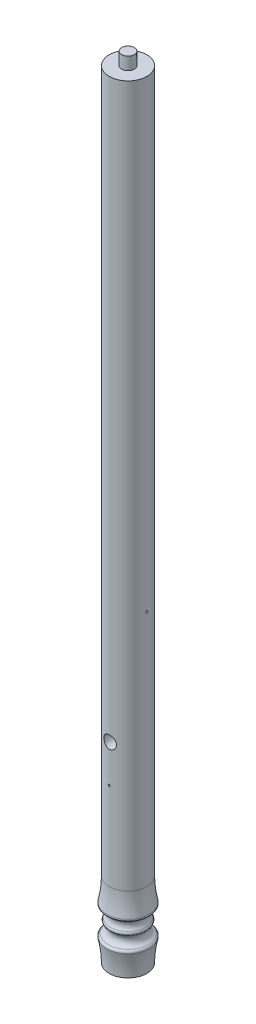
ISO-10303-21;
HEADER;
FILE_DESCRIPTION(('STEP AP214'),'2;1');
FILE_NAME('part.step','',(''),(''),'','','');
FILE_SCHEMA(('AUTOMOTIVE_DESIGN { 1 0 10303 214 1 1 1 1 }'));
ENDSEC;
DATA;
#1=APPLICATION_CONTEXT('core data for automotive mechanical design processes');
#2=APPLICATION_PROTOCOL_DEFINITION('international standard','automotive_design',2000,#1);
#3=PRODUCT_CONTEXT('',#1,'mechanical');
#4=PRODUCT('Part','Part','',(#3));
#5=PRODUCT_RELATED_PRODUCT_CATEGORY('part','',(#4));
#6=PRODUCT_DEFINITION_FORMATION('','',#4);
#7=PRODUCT_DEFINITION_CONTEXT('part definition',#1,'design');
#8=PRODUCT_DEFINITION('design','',#6,#7);
#9=PRODUCT_DEFINITION_SHAPE('','',#8);
#10=(LENGTH_UNIT() NAMED_UNIT(*) SI_UNIT(.MILLI.,.METRE.));
#11=(NAMED_UNIT(*) PLANE_ANGLE_UNIT() SI_UNIT($,.RADIAN.));
#12=(NAMED_UNIT(*) SI_UNIT($,.STERADIAN.) SOLID_ANGLE_UNIT());
#13=UNCERTAINTY_MEASURE_WITH_UNIT(LENGTH_MEASURE(1.E-05),#10,'distance_accuracy_value','');
#14=(GEOMETRIC_REPRESENTATION_CONTEXT(3) GLOBAL_UNCERTAINTY_ASSIGNED_CONTEXT((#13)) GLOBAL_UNIT_ASSIGNED_CONTEXT((#10,
#11,#12)) REPRESENTATION_CONTEXT('',''));
#15=CARTESIAN_POINT('',(0.,0.,0.));
#16=DIRECTION('',(0.,0.,1.));
#17=DIRECTION('',(1.,0.,0.));
#18=AXIS2_PLACEMENT_3D('',#15,#16,#17);
#19=CARTESIAN_POINT('',(6.35,800.1,0.));
#20=DIRECTION('',(0.,1.,0.));
#21=DIRECTION('',(0.,0.,1.));
#22=AXIS2_PLACEMENT_3D('',#19,#20,#21);
#23=PLANE('',#22);
#24=CARTESIAN_POINT('',(0.,800.1,0.));
#25=DIRECTION('',(0.,-1.,0.));
#26=DIRECTION('',(0.,0.,-1.));
#27=AXIS2_PLACEMENT_3D('',#24,#25,#26);
#28=CIRCLE('',#27,6.35);
#29=CARTESIAN_POINT('',(0.,800.1,-6.35));
#30=VERTEX_POINT('',#29);
#31=EDGE_CURVE('E61',#30,#30,#28,.T.);
#32=ORIENTED_EDGE('',*,*,#31,.F.);
#33=EDGE_LOOP('',(#32));
#34=FACE_BOUND('',#33,.T.);
#35=ADVANCED_FACE('F42',(#34),#23,.T.);
#36=CARTESIAN_POINT('',(0.,-55.,0.));
#37=DIRECTION('',(0.,-1.,0.));
#38=DIRECTION('',(0.,0.,-1.));
#39=AXIS2_PLACEMENT_3D('',#36,#37,#38);
#40=CYLINDRICAL_SURFACE('',#39,6.35);
#41=ORIENTED_EDGE('',*,*,#31,.T.);
#42=EDGE_LOOP('',(#41));
#43=FACE_BOUND('',#42,.T.);
#44=CARTESIAN_POINT('',(0.,787.4,0.));
#45=DIRECTION('',(0.,-1.,0.));
#46=DIRECTION('',(0.,0.,-1.));
#47=AXIS2_PLACEMENT_3D('',#44,#45,#46);
#48=CIRCLE('',#47,6.35);
#49=CARTESIAN_POINT('',(0.,787.4,-6.35));
#50=VERTEX_POINT('',#49);
#51=EDGE_CURVE('E136',#50,#50,#48,.T.);
#52=ORIENTED_EDGE('',*,*,#51,.F.);
#53=EDGE_LOOP('',(#52));
#54=FACE_BOUND('',#53,.T.);
#55=ADVANCED_FACE('F128',(#43,#54),#40,.T.);
#56=CARTESIAN_POINT('',(19.05,787.4,0.));
#57=DIRECTION('',(0.,1.,0.));
#58=DIRECTION('',(0.,0.,1.));
#59=AXIS2_PLACEMENT_3D('',#56,#57,#58);
#60=PLANE('',#59);
#61=ORIENTED_EDGE('',*,*,#51,.T.);
#62=EDGE_LOOP('',(#61));
#63=FACE_BOUND('',#62,.T.);
#64=CARTESIAN_POINT('',(0.,787.4,0.));
#65=DIRECTION('',(0.,-1.,0.));
#66=DIRECTION('',(0.,0.,-1.));
#67=AXIS2_PLACEMENT_3D('',#64,#65,#66);
#68=CIRCLE('',#67,19.05);
#69=CARTESIAN_POINT('',(0.,787.4,-19.05));
#70=VERTEX_POINT('',#69);
#71=EDGE_CURVE('E138',#70,#70,#68,.T.);
#72=ORIENTED_EDGE('',*,*,#71,.F.);
#73=EDGE_LOOP('',(#72));
#74=FACE_BOUND('',#73,.T.);
#75=ADVANCED_FACE('F123',(#63,#74),#60,.T.);
#76=CARTESIAN_POINT('',(0.,-55.,0.));
#77=DIRECTION('',(0.,-1.,0.));
#78=DIRECTION('',(0.,0.,-1.));
#79=AXIS2_PLACEMENT_3D('',#76,#77,#78);
#80=CYLINDRICAL_SURFACE('',#79,19.05);
#81=CARTESIAN_POINT('',(0.992187499999998,165.1,19.0241442373854));
#82=CARTESIAN_POINT('',(0.992185043218346,165.155691040269,19.0241445844981));
#83=CARTESIAN_POINT('',(0.98748288059813,165.211421499591,19.0243914099017));
#84=CARTESIAN_POINT('',(0.968791831717696,165.321344788775,19.0253522064706));
#85=CARTESIAN_POINT('',(0.954792023444044,165.375535731991,19.0260667270266));
#86=CARTESIAN_POINT('',(0.917907802003896,165.480771746707,19.0278817588493));
#87=CARTESIAN_POINT('',(0.895027942268089,165.53181841498,19.0289820722649));
#88=CARTESIAN_POINT('',(0.841040141353868,165.629332847607,19.0314444572828));
#89=CARTESIAN_POINT('',(0.809934133584581,165.675801684381,19.0328064673575));
#90=CARTESIAN_POINT('',(0.740339501141854,165.762905625914,19.035640462504));
#91=CARTESIAN_POINT('',(0.701843873817429,165.80353513275,19.0371125510756));
#92=CARTESIAN_POINT('',(0.618576834785258,165.87775933255,19.0399998546066));
#93=CARTESIAN_POINT('',(0.573805166193708,165.911353737422,19.0414150672349));
#94=CARTESIAN_POINT('',(0.479227279740542,165.970569807011,19.0440299566155));
#95=CARTESIAN_POINT('',(0.429418302243197,165.996187069847,19.0452295142131));
#96=CARTESIAN_POINT('',(0.326199109710824,166.038693435084,19.0472768660109));
#97=CARTESIAN_POINT('',(0.272788923639586,166.055582607674,19.0481246630397));
#98=CARTESIAN_POINT('',(0.163935309033025,166.0801384693,19.0493722619553));
#99=CARTESIAN_POINT('',(0.108493788296328,166.087813594265,19.0497724736062));
#100=CARTESIAN_POINT('',(-0.00289203821465988,166.093749528879,19.0500811779553));
#101=CARTESIAN_POINT('',(-0.0588363397694651,166.092010417462,19.0499896747764));
#102=CARTESIAN_POINT('',(-0.169582550048771,166.07917424011,19.0493256053153));
#103=CARTESIAN_POINT('',(-0.224385514286971,166.068086253306,19.0487535057648));
#104=CARTESIAN_POINT('',(-0.331351237859761,166.036881148761,19.0471932164615));
#105=CARTESIAN_POINT('',(-0.383513985432034,166.016763990798,19.0462050248553));
#106=CARTESIAN_POINT('',(-0.483747787649793,165.968061255084,19.0439230534334));
#107=CARTESIAN_POINT('',(-0.53181683042676,165.939471544027,19.0426291245274));
#108=CARTESIAN_POINT('',(-0.622476732686098,165.874638275899,19.0398813805816));
#109=CARTESIAN_POINT('',(-0.665067550003376,165.838394659922,19.0384275643113));
#110=CARTESIAN_POINT('',(-0.74361496173046,165.759231086143,19.0355217132746));
#111=CARTESIAN_POINT('',(-0.779563617494958,165.716303250859,19.0340696826742));
#112=CARTESIAN_POINT('',(-0.843745091636795,165.625017464577,19.0313328350708));
#113=CARTESIAN_POINT('',(-0.871977907829854,165.576659512042,19.0300480181152));
#114=CARTESIAN_POINT('',(-0.919925602894831,165.475881366086,19.027790620048));
#115=CARTESIAN_POINT('',(-0.939640177830428,165.423461027796,19.0268180500779));
#116=CARTESIAN_POINT('',(-0.96998643661068,165.316048317854,19.0252952446916));
#117=CARTESIAN_POINT('',(-0.980618194580318,165.261055967198,19.0247450058288));
#118=CARTESIAN_POINT('',(-0.992487193400962,165.150129431922,19.0241295521151));
#119=CARTESIAN_POINT('',(-0.993735455263746,165.094196429555,19.0240637682688));
#120=CARTESIAN_POINT('',(-0.98683079419403,164.982915523289,19.0244231574489));
#121=CARTESIAN_POINT('',(-0.978677905042498,164.927567617287,19.0248483287111));
#122=CARTESIAN_POINT('',(-0.953211515392871,164.819059017006,19.0261411888976));
#123=CARTESIAN_POINT('',(-0.935903064093436,164.765897134556,19.0270086339029));
#124=CARTESIAN_POINT('',(-0.892621984222755,164.663233039659,19.0290880675672));
#125=CARTESIAN_POINT('',(-0.866649301193354,164.613730850218,19.0303000583919));
#126=CARTESIAN_POINT('',(-0.806748759969968,164.51974063529,19.0329333686741));
#127=CARTESIAN_POINT('',(-0.77281350146442,164.475257331588,19.0343548823998));
#128=CARTESIAN_POINT('',(-0.697961912101311,164.392615113154,19.0372463406283));
#129=CARTESIAN_POINT('',(-0.657045533033046,164.354456242102,19.0387162854655));
#130=CARTESIAN_POINT('',(-0.569345817653353,164.285509015214,19.0415405971984));
#131=CARTESIAN_POINT('',(-0.522556879015775,164.254727780214,19.0428948516259));
#132=CARTESIAN_POINT('',(-0.424468506096285,164.201458278856,19.0453335519248));
#133=CARTESIAN_POINT('',(-0.373169092693557,164.178969974113,19.046417999045));
#134=CARTESIAN_POINT('',(-0.267542414703524,164.142937135282,19.0481943335062));
#135=CARTESIAN_POINT('',(-0.213216705104964,164.129388053132,19.0488864204454));
#136=CARTESIAN_POINT('',(-0.103057793332053,164.111603375609,19.049800833078));
#137=CARTESIAN_POINT('',(-0.0472246006214822,164.107367721783,19.0500231617197));
#138=CARTESIAN_POINT('',(0.0642937334500748,164.108330690854,19.0499730147725));
#139=CARTESIAN_POINT('',(0.119978971836073,164.11351814813,19.0497011247923));
#140=CARTESIAN_POINT('',(0.229686785936969,164.133156994488,19.0486942988733));
#141=CARTESIAN_POINT('',(0.283709358547306,164.147608400865,19.04795936207));
#142=CARTESIAN_POINT('',(0.388560558652384,164.185362595864,19.0461091152987));
#143=CARTESIAN_POINT('',(0.43938916847163,164.208665433465,19.0449938032257));
#144=CARTESIAN_POINT('',(0.536413419752289,164.263459151626,19.0425082060983));
#145=CARTESIAN_POINT('',(0.582609200027987,164.294949786752,19.0411379286869));
#146=CARTESIAN_POINT('',(0.669112419537181,164.365265445288,19.0382947482456));
#147=CARTESIAN_POINT('',(0.709413479039021,164.404098312381,19.036821736537));
#148=CARTESIAN_POINT('',(0.782937242487253,164.487989815767,19.0339398703215));
#149=CARTESIAN_POINT('',(0.816158203878474,164.533049980237,19.0325310316757));
#150=CARTESIAN_POINT('',(0.874595691160242,164.628154846084,19.0299354053937));
#151=CARTESIAN_POINT('',(0.899804163964569,164.678204496294,19.0287488416472));
#152=CARTESIAN_POINT('',(0.941429919122817,164.781794690062,19.0267350873092));
#153=CARTESIAN_POINT('',(0.957857572260151,164.835331031335,19.0259074729913));
#154=CARTESIAN_POINT('',(0.977152274060882,164.924332699273,19.0249237977219));
#155=CARTESIAN_POINT('',(0.982783271460175,164.959221714481,19.0246327544357));
#156=CARTESIAN_POINT('',(0.990301661453891,165.029401872141,19.0242428643261));
#157=CARTESIAN_POINT('',(0.99218905754955,165.064693014217,19.024144017323));
#158=CARTESIAN_POINT('',(0.992187499999998,165.1,19.0241442373854));
#159=B_SPLINE_CURVE_WITH_KNOTS('',3,(#81,#82,#83,#84,#85,#86,#87,#88,#89,#90,#91,#92,#93,#94,
#95,#96,#97,#98,#99,#100,#101,#102,#103,#104,#105,#106,#107,#108,#109,#110,#111,#112,#113,#114,
#115,#116,#117,#118,#119,#120,#121,#122,#123,#124,#125,#126,#127,#128,#129,#130,#131,#132,#133,
#134,#135,#136,#137,#138,#139,#140,#141,#142,#143,#144,#145,#146,#147,#148,#149,#150,#151,#152,
#153,#154,#155,#156,#157,#158),.UNSPECIFIED.,.T.,.F.,(4,2,2,2,2,2,2,2,2,2,2,2,2,2,2,2,2,2,2,2,2,
2,2,2,2,2,2,2,2,2,2,2,2,2,2,2,2,2,4),(0.,0.166944235449867,0.334084929236068,0.50114003115342,
0.668155904594897,0.835330836242241,1.0025126125034,1.16978647882007,1.33705899994744,
1.50417825750044,1.67129611384644,1.83825186091775,2.00520835172111,2.17224642611245,
2.33928578609428,2.50652351637451,2.67376129399809,2.84100503828037,3.00824741767132,
3.17529333844778,3.34233865898338,3.50929195163695,3.67624629367838,3.84335641979014,
4.01046769998924,4.17773963092771,4.34501078759792,4.51219677491244,4.67938171289952,
4.84636867951507,5.01335595791301,5.18034416034276,5.34732735777981,5.51448996120054,
5.68169365932357,5.84906488079926,6.01623798549644,6.12207733114073,6.22791657779776),.UNSPECIFIED.);
#160=CARTESIAN_POINT('',(0.992187499999998,165.1,19.0241442373854));
#161=VERTEX_POINT('',#160);
#162=EDGE_CURVE('E12',#161,#161,#159,.T.);
#163=ORIENTED_EDGE('',*,*,#162,.F.);
#164=EDGE_LOOP('',(#163));
#165=FACE_BOUND('',#164,.T.);
#166=CARTESIAN_POINT('',(6.35,203.2,17.9605122421383));
#167=CARTESIAN_POINT('',(6.35000007467186,203.372904889361,17.9605121841743));
#168=CARTESIAN_POINT('',(6.3429320744315,203.54580869932,17.9630158170993));
#169=CARTESIAN_POINT('',(6.31472584323583,203.890384353829,17.9729507908354));
#170=CARTESIAN_POINT('',(6.29358247647192,204.062055725569,17.9803839303173));
#171=CARTESIAN_POINT('',(6.23743424237859,204.402797778446,17.9999387474086));
#172=CARTESIAN_POINT('',(6.20243278653587,204.571869089014,18.0120592710938));
#173=CARTESIAN_POINT('',(6.1188793825932,204.906322983684,18.0406142280405));
#174=CARTESIAN_POINT('',(6.07032213901403,205.071704098914,18.0570503470113));
#175=CARTESIAN_POINT('',(5.96022151507749,205.39720479015,18.0936898864177));
#176=CARTESIAN_POINT('',(5.89870940004715,205.557335980017,18.1138842233465));
#177=CARTESIAN_POINT('',(5.76310329571688,205.871791643544,18.1574836120493));
#178=CARTESIAN_POINT('',(5.68900463798159,206.026113936605,18.1808898545199));
#179=CARTESIAN_POINT('',(5.52880871589195,206.327932045638,18.2302439315275));
#180=CARTESIAN_POINT('',(5.44271370019568,206.475429134074,18.2561912894747));
#181=CARTESIAN_POINT('',(5.25907267568228,206.762828565815,18.3099374140938));
#182=CARTESIAN_POINT('',(5.16152255221945,206.902728153566,18.3377368444647));
#183=CARTESIAN_POINT('',(4.9519704663745,207.178892454386,18.3954535011269));
#184=CARTESIAN_POINT('',(4.83957945535955,207.314853715155,18.4254108542597));
#185=CARTESIAN_POINT('',(4.60392786160509,207.576916980907,18.4857008813243));
#186=CARTESIAN_POINT('',(4.48066706722363,207.70301879383,18.5160335625541));
#187=CARTESIAN_POINT('',(4.22398755491756,207.944628902319,18.5762700584007));
#188=CARTESIAN_POINT('',(4.09056546226526,208.060133650106,18.6061737265825));
#189=CARTESIAN_POINT('',(3.81445197871255,208.279720436423,18.6647358311806));
#190=CARTESIAN_POINT('',(3.67176383491662,208.383806442406,18.6933946980002));
#191=CARTESIAN_POINT('',(3.37403362595511,208.582496600939,18.7494517961145));
#192=CARTESIAN_POINT('',(3.21876410858282,208.676775524071,18.776796334375));
#193=CARTESIAN_POINT('',(2.90040622051583,208.851825218583,18.828598949967));
#194=CARTESIAN_POINT('',(2.73732096720632,208.932601318944,18.853058164884));
#195=CARTESIAN_POINT('',(2.40436062510117,209.08002587764,18.8984068456182));
#196=CARTESIAN_POINT('',(2.23448415681591,209.146671448152,18.9192955815763));
#197=CARTESIAN_POINT('',(1.88927888325926,209.265180132633,18.9568787025541));
#198=CARTESIAN_POINT('',(1.71395256686033,209.317049887631,18.9735749714878));
#199=CARTESIAN_POINT('',(1.36522428846162,209.404017816687,19.0017947733667));
#200=CARTESIAN_POINT('',(1.19196364650287,209.439631609418,19.01347650807));
#201=CARTESIAN_POINT('',(0.842895111101337,209.496290767647,19.0321454456513));
#202=CARTESIAN_POINT('',(0.667088294148725,209.517342116387,19.0391345765353));
#203=CARTESIAN_POINT('',(0.314209218879324,209.544689916081,19.0482262560928));
#204=CARTESIAN_POINT('',(0.137136994473655,209.550986760958,19.0503289352273));
#205=CARTESIAN_POINT('',(-0.216901921002752,209.548762746674,19.049587568049));
#206=CARTESIAN_POINT('',(-0.393868614421923,209.540242230575,19.0467436362635));
#207=CARTESIAN_POINT('',(-0.739365284519371,209.509098834915,19.036399993617));
#208=CARTESIAN_POINT('',(-0.907952629393979,209.487045678578,19.0290884203769));
#209=CARTESIAN_POINT('',(-1.24263965626491,209.429541429088,19.0101669985195));
#210=CARTESIAN_POINT('',(-1.40873847746822,209.394085806336,18.9985556967605));
#211=CARTESIAN_POINT('',(-1.73720119624073,209.310103056509,18.9713411108767));
#212=CARTESIAN_POINT('',(-1.89956629068115,209.261580183459,18.9557391259958));
#213=CARTESIAN_POINT('',(-2.21961616319674,209.151842972193,18.9209335884611));
#214=CARTESIAN_POINT('',(-2.37729914957653,209.090623845284,18.9017286771399));
#215=CARTESIAN_POINT('',(-2.68891421853452,208.95512588426,18.8599382105028));
#216=CARTESIAN_POINT('',(-2.84277277712819,208.880690392267,18.8373126491989));
#217=CARTESIAN_POINT('',(-3.14372828729916,208.719836604718,18.7894305663877));
#218=CARTESIAN_POINT('',(-3.29082290202757,208.633414208657,18.7641731453072));
#219=CARTESIAN_POINT('',(-3.57734506918722,208.449201047919,18.7116626522826));
#220=CARTESIAN_POINT('',(-3.71677219114134,208.351409645908,18.6844094684901));
#221=CARTESIAN_POINT('',(-3.98716495399287,208.145092345574,18.6285822698494));
#222=CARTESIAN_POINT('',(-4.11813028669789,208.036566056633,18.6000082069575));
#223=CARTESIAN_POINT('',(-4.37684545048267,207.804061657267,18.5408779551479));
#224=CARTESIAN_POINT('',(-4.50415027127114,207.6795955105,18.5102919359601));
#225=CARTESIAN_POINT('',(-4.7478433962042,207.420439729617,18.4492888676298));
#226=CARTESIAN_POINT('',(-4.86423510815806,207.28575331089,18.4188717685491));
#227=CARTESIAN_POINT('',(-5.08546063018025,207.006873293863,18.3590231511138));
#228=CARTESIAN_POINT('',(-5.19028832447544,206.862674728752,18.3295921599489));
#229=CARTESIAN_POINT('',(-5.38756027003842,206.56577596231,18.2725815338622));
#230=CARTESIAN_POINT('',(-5.48000935232799,206.41307911075,18.2450011787983));
#231=CARTESIAN_POINT('',(-5.65315834756607,206.097778751356,18.1921032459389));
#232=CARTESIAN_POINT('',(-5.73366516353338,205.935062459729,18.1668249772564));
#233=CARTESIAN_POINT('',(-5.88057969904577,205.602964036741,18.1198022602485));
#234=CARTESIAN_POINT('',(-5.94699291679966,205.43358453552,18.0980564346222));
#235=CARTESIAN_POINT('',(-6.06515064268836,205.089327918963,18.0588019342271));
#236=CARTESIAN_POINT('',(-6.11689722174378,204.914451583655,18.0412926613107));
#237=CARTESIAN_POINT('',(-6.20522346520948,204.560502363422,18.0111045097315));
#238=CARTESIAN_POINT('',(-6.24180391182511,204.381429695431,17.9984253819528));
#239=CARTESIAN_POINT('',(-6.298116997968,204.02865770232,17.9787949890032));
#240=CARTESIAN_POINT('',(-6.31853543370885,203.855080565666,17.971611063163));
#241=CARTESIAN_POINT('',(-6.34499394377563,203.506700961397,17.962286912437));
#242=CARTESIAN_POINT('',(-6.35103452507011,203.331898537203,17.9601465097146));
#243=CARTESIAN_POINT('',(-6.34867652793738,202.982432503792,17.9609801314463));
#244=CARTESIAN_POINT('',(-6.34028025622768,202.807768876858,17.9639533388488));
#245=CARTESIAN_POINT('',(-6.309138563187,202.459886859651,17.9749142495206));
#246=CARTESIAN_POINT('',(-6.28639331827605,202.286668451635,17.9829018911375));
#247=CARTESIAN_POINT('',(-6.22781361622577,201.948923786007,18.0032708197849));
#248=CARTESIAN_POINT('',(-6.19245924965254,201.784304144327,18.0154905329272));
#249=CARTESIAN_POINT('',(-6.1088890589727,201.458667222114,18.0439996158971));
#250=CARTESIAN_POINT('',(-6.06066897527755,201.297651153825,18.0602903334414));
#251=CARTESIAN_POINT('',(-5.95178614996645,200.980344253033,18.0964645265794));
#252=CARTESIAN_POINT('',(-5.89112619656182,200.824052370664,18.1163471969716));
#253=CARTESIAN_POINT('',(-5.75780047904466,200.517043863517,18.1591611703442));
#254=CARTESIAN_POINT('',(-5.68513015384567,200.366329383541,18.1820936308712));
#255=CARTESIAN_POINT('',(-5.52585539435068,200.066776077376,18.2311431035954));
#256=CARTESIAN_POINT('',(-5.43888551843611,199.918144213939,18.257337418412));
#257=CARTESIAN_POINT('',(-5.25331510969612,199.628619635699,18.3115953760894));
#258=CARTESIAN_POINT('',(-5.15471056388416,199.487729615888,18.3396596624723));
#259=CARTESIAN_POINT('',(-4.94651983263571,199.214534062527,18.3969044730028));
#260=CARTESIAN_POINT('',(-4.83693265707057,199.082229304748,18.4260850976459));
#261=CARTESIAN_POINT('',(-4.60744722274103,198.826970457001,18.4848033864811));
#262=CARTESIAN_POINT('',(-4.48754872480688,198.70401658405,18.5143410589412));
#263=CARTESIAN_POINT('',(-4.23209963560971,198.462468313809,18.5744412121884));
#264=CARTESIAN_POINT('',(-4.09607248840989,198.344372396216,18.6049841614765));
#265=CARTESIAN_POINT('',(-3.81435164909173,198.120075783773,18.664778246815));
#266=CARTESIAN_POINT('',(-3.66866120488883,198.01387112411,18.6940298114599));
#267=CARTESIAN_POINT('',(-3.36843369307492,197.814029018183,18.7504530318865));
#268=CARTESIAN_POINT('',(-3.21389329221659,197.720396352035,18.7776238948672));
#269=CARTESIAN_POINT('',(-2.89708847566715,197.546504266404,18.8291029215125));
#270=CARTESIAN_POINT('',(-2.73482733528807,197.466239239962,18.8534122841516));
#271=CARTESIAN_POINT('',(-2.40465168177923,197.320158532148,18.8983526620097));
#272=CARTESIAN_POINT('',(-2.23677842238125,197.25425641078,18.9190055333313));
#273=CARTESIAN_POINT('',(-1.89569072154765,197.136884410199,18.9562198624823));
#274=CARTESIAN_POINT('',(-1.72247847967075,197.085408673518,18.9727829805259));
#275=CARTESIAN_POINT('',(-1.37195443604881,196.997347928175,19.0013461729396));
#276=CARTESIAN_POINT('',(-1.19464302596228,196.960761503064,19.0133466813523));
#277=CARTESIAN_POINT('',(-0.837286870863805,196.902841052107,19.0324318084485));
#278=CARTESIAN_POINT('',(-0.657242243866576,196.881506369625,19.0395166387673));
#279=CARTESIAN_POINT('',(-0.304399939069074,196.854950793771,19.0483464738216));
#280=CARTESIAN_POINT('',(-0.131661476409825,196.849016627736,19.050327811339));
#281=CARTESIAN_POINT('',(0.213775392275974,196.85124883539,19.049583701765));
#282=CARTESIAN_POINT('',(0.386473764626108,196.859420011876,19.0468566514914));
#283=CARTESIAN_POINT('',(0.730414910159569,196.889787139717,19.036769222305));
#284=CARTESIAN_POINT('',(0.901658307858205,196.911976730034,19.0294109448771));
#285=CARTESIAN_POINT('',(1.24159215291772,196.970176911002,19.010258841641));
#286=CARTESIAN_POINT('',(1.41028162241908,197.006192662985,18.9984633594488));
#287=CARTESIAN_POINT('',(1.74113205541995,197.091019049772,18.9709796061496));
#288=CARTESIAN_POINT('',(1.90335462060483,197.139611475508,18.9553579469971));
#289=CARTESIAN_POINT('',(2.22311558916084,197.249466677602,18.920521496432));
#290=CARTESIAN_POINT('',(2.38065230104731,197.3107339673,18.9013054253338));
#291=CARTESIAN_POINT('',(2.68996559538902,197.445433581555,18.8597702235758));
#292=CARTESIAN_POINT('',(2.84174342474923,197.518863254042,18.8374517695764));
#293=CARTESIAN_POINT('',(3.13872746855849,197.677388806124,18.7902503646299));
#294=CARTESIAN_POINT('',(3.28393130265415,197.762488867175,18.7653664953012));
#295=CARTESIAN_POINT('',(3.57209205622814,197.947095714141,18.7126933760356));
#296=CARTESIAN_POINT('',(3.71477001212557,198.047017192484,18.6848309370529));
#297=CARTESIAN_POINT('',(3.99127224330517,198.2580874263,18.6277261015556));
#298=CARTESIAN_POINT('',(4.125096208222,198.369236574998,18.5984836567283));
#299=CARTESIAN_POINT('',(4.38316388676335,198.602109747918,18.5393610594388));
#300=CARTESIAN_POINT('',(4.50740324126622,198.723838530901,18.5094806246122));
#301=CARTESIAN_POINT('',(4.74546004441079,198.977051111197,18.4498824788936));
#302=CARTESIAN_POINT('',(4.85928083833073,199.108531752582,18.4201647186707));
#303=CARTESIAN_POINT('',(5.08014127120139,199.385904679787,18.3605083051536));
#304=CARTESIAN_POINT('',(5.18673395080547,199.53216146794,18.3306074981088));
#305=CARTESIAN_POINT('',(5.38716410257996,199.833445881564,18.2727076517125));
#306=CARTESIAN_POINT('',(5.48100632994388,199.988470206525,18.2447079053334));
#307=CARTESIAN_POINT('',(5.65528861435426,200.306373373264,18.191440834821));
#308=CARTESIAN_POINT('',(5.73572598484047,200.46925378112,18.1661740587765));
#309=CARTESIAN_POINT('',(5.88247472021432,200.801671020857,18.1191867962331));
#310=CARTESIAN_POINT('',(5.9487924600178,200.971204807661,18.09746471037));
#311=CARTESIAN_POINT('',(6.06410020462713,201.308057840573,18.0591448851981));
#312=CARTESIAN_POINT('',(6.11373361228482,201.475135783141,18.042361110104));
#313=CARTESIAN_POINT('',(6.19914429051322,201.813106231664,18.0131937705727));
#314=CARTESIAN_POINT('',(6.2349272745633,201.983997133889,18.0008083919142));
#315=CARTESIAN_POINT('',(6.29232024349929,202.328403857294,17.9808267796658));
#316=CARTESIAN_POINT('',(6.31393168801609,202.501919406258,17.9732300528606));
#317=CARTESIAN_POINT('',(6.34277149992563,202.85029034166,17.9630728234143));
#318=CARTESIAN_POINT('',(6.34999992448626,203.02514572277,17.9605123007558));
#319=CARTESIAN_POINT('',(6.35,203.2,17.9605122421383));
#320=B_SPLINE_CURVE_WITH_KNOTS('',3,(#166,#167,#168,#169,#170,#171,#172,#173,#174,#175,#176,
#177,#178,#179,#180,#181,#182,#183,#184,#185,#186,#187,#188,#189,#190,#191,#192,#193,#194,#195,
#196,#197,#198,#199,#200,#201,#202,#203,#204,#205,#206,#207,#208,#209,#210,#211,#212,#213,#214,
#215,#216,#217,#218,#219,#220,#221,#222,#223,#224,#225,#226,#227,#228,#229,#230,#231,#232,#233,
#234,#235,#236,#237,#238,#239,#240,#241,#242,#243,#244,#245,#246,#247,#248,#249,#250,#251,#252,
#253,#254,#255,#256,#257,#258,#259,#260,#261,#262,#263,#264,#265,#266,#267,#268,#269,#270,#271,
#272,#273,#274,#275,#276,#277,#278,#279,#280,#281,#282,#283,#284,#285,#286,#287,#288,#289,#290,
#291,#292,#293,#294,#295,#296,#297,#298,#299,#300,#301,#302,#303,#304,#305,#306,#307,#308,#309,
#310,#311,#312,#313,#314,#315,#316,#317,#318,#319),.UNSPECIFIED.,.T.,.F.,(4,2,2,2,2,2,2,2,2,2,2,
2,2,2,2,2,2,2,2,2,2,2,2,2,2,2,2,2,2,2,2,2,2,2,2,2,2,2,2,2,2,2,2,2,2,2,2,2,2,2,2,2,2,2,2,2,2,2,2,
2,2,2,2,2,2,2,2,2,2,2,2,2,2,2,2,2,4),(0.,0.518551190720193,1.03729169377051,1.55590457625912,
2.07472033562746,2.59229804482699,3.11006814803521,3.62774132802883,4.14560102700589,
4.68177234198808,5.21795409888998,5.75431471335885,6.29048837466618,6.84090158058546,
7.39109704669765,7.94140484680645,8.49146491800032,9.02260055284765,9.55351783122658,
10.084420934737,10.6153117465768,11.1252544428486,11.6353696375179,12.145318965252,
12.6554609833795,13.1721116844525,13.6889395603306,14.2057964229859,14.7226720998248,
15.2639930028963,15.8051443021139,16.3465804375137,16.8878046459562,17.4370000687287,
17.9859808433418,18.5348840635371,19.0837589700888,19.6078648257983,20.1319522010648,
20.6559558455358,21.179953047529,21.6858208709719,22.1918563856785,22.697778603788,
23.2038933954328,23.7258764687288,24.2480401116692,24.7702508722021,25.2924737486133,
25.8399546814312,26.3872525247409,26.934757875636,27.482032997888,28.0259174775812,
28.5695808058328,29.113192402254,29.656780593024,30.1747024737474,30.6928007390253,
31.2106640791972,31.728720927042,32.2383303533507,32.7481215577425,33.2578017455691,
33.7676650293052,34.2962769393839,34.8249073694707,35.3537768226458,35.8824758619216,
36.4321092541269,36.9815370983736,37.5310749251787,38.0803641108161,38.605034396734,
39.1294880181041,39.6538876136575,40.1782851248866),.UNSPECIFIED.);
#321=CARTESIAN_POINT('',(6.35,203.2,17.9605122421383));
#322=VERTEX_POINT('',#321);
#323=EDGE_CURVE('E53',#322,#322,#320,.T.);
#324=ORIENTED_EDGE('',*,*,#323,.F.);
#325=EDGE_LOOP('',(#324));
#326=FACE_BOUND('',#325,.T.);
#327=CARTESIAN_POINT('',(19.0241442373854,317.5,-0.992187499999998));
#328=CARTESIAN_POINT('',(19.0241445844981,317.555691040269,-0.992185043218346));
#329=CARTESIAN_POINT('',(19.0243914099017,317.611421499591,-0.987482880598128));
#330=CARTESIAN_POINT('',(19.0253522064706,317.721344788775,-0.968791831717693));
#331=CARTESIAN_POINT('',(19.0260667270266,317.775535731991,-0.954792023444037));
#332=CARTESIAN_POINT('',(19.0278817588493,317.880771746707,-0.91790780200389));
#333=CARTESIAN_POINT('',(19.0289820722649,317.93181841498,-0.895027942268089));
#334=CARTESIAN_POINT('',(19.0314444572828,318.029332847607,-0.841040141353861));
#335=CARTESIAN_POINT('',(19.0328064673575,318.075801684381,-0.809934133584558));
#336=CARTESIAN_POINT('',(19.035640462504,318.162905625914,-0.740339501141833));
#337=CARTESIAN_POINT('',(19.0371125510756,318.20353513275,-0.701843873817424));
#338=CARTESIAN_POINT('',(19.0399998546066,318.27775933255,-0.618576834785262));
#339=CARTESIAN_POINT('',(19.0414150672349,318.311353737422,-0.573805166193703));
#340=CARTESIAN_POINT('',(19.0440299566155,318.370569807011,-0.479227279740522));
#341=CARTESIAN_POINT('',(19.0452295142131,318.396187069847,-0.429418302243168));
#342=CARTESIAN_POINT('',(19.0472768660109,318.438693435084,-0.326199109710785));
#343=CARTESIAN_POINT('',(19.0481246630397,318.455582607674,-0.272788923639546));
#344=CARTESIAN_POINT('',(19.0493722619553,318.4801384693,-0.163935309032981));
#345=CARTESIAN_POINT('',(19.0497724736062,318.487813594265,-0.108493788296282));
#346=CARTESIAN_POINT('',(19.0500811779553,318.493749528879,0.00289203821470772));
#347=CARTESIAN_POINT('',(19.0499896747764,318.492010417462,0.0588363397695124));
#348=CARTESIAN_POINT('',(19.0493256053153,318.47917424011,0.16958255004882));
#349=CARTESIAN_POINT('',(19.0487535057648,318.468086253306,0.224385514287023));
#350=CARTESIAN_POINT('',(19.0471932164615,318.436881148761,0.331351237859812));
#351=CARTESIAN_POINT('',(19.0462050248553,318.416763990798,0.383513985432079));
#352=CARTESIAN_POINT('',(19.0439230534334,318.368061255084,0.483747787649828));
#353=CARTESIAN_POINT('',(19.0426291245274,318.339471544027,0.53181683042679));
#354=CARTESIAN_POINT('',(19.0398813805816,318.274638275899,0.622476732686119));
#355=CARTESIAN_POINT('',(19.0384275643113,318.238394659922,0.665067550003392));
#356=CARTESIAN_POINT('',(19.0355217132746,318.159231086143,0.74361496173048));
#357=CARTESIAN_POINT('',(19.0340696826742,318.116303250859,0.779563617494988));
#358=CARTESIAN_POINT('',(19.0313328350708,318.025017464577,0.843745091636823));
#359=CARTESIAN_POINT('',(19.0300480181152,317.976659512042,0.87197790782987));
#360=CARTESIAN_POINT('',(19.027790620048,317.875881366086,0.919925602894837));
#361=CARTESIAN_POINT('',(19.0268180500779,317.823461027796,0.939640177830436));
#362=CARTESIAN_POINT('',(19.0252952446916,317.716048317854,0.969986436610687));
#363=CARTESIAN_POINT('',(19.0247450058288,317.661055967198,0.980618194580323));
#364=CARTESIAN_POINT('',(19.0241295521151,317.550129431922,0.992487193400964));
#365=CARTESIAN_POINT('',(19.0240637682688,317.494196429555,0.993735455263747));
#366=CARTESIAN_POINT('',(19.0244231574489,317.382915523289,0.986830794194031));
#367=CARTESIAN_POINT('',(19.0248483287111,317.327567617287,0.978677905042497));
#368=CARTESIAN_POINT('',(19.0261411888976,317.219059017006,0.953211515392859));
#369=CARTESIAN_POINT('',(19.0270086339029,317.165897134556,0.935903064093415));
#370=CARTESIAN_POINT('',(19.0290880675672,317.063233039659,0.892621984222719));
#371=CARTESIAN_POINT('',(19.0303000583919,317.013730850218,0.866649301193308));
#372=CARTESIAN_POINT('',(19.0329333686741,316.91974063529,0.806748759969909));
#373=CARTESIAN_POINT('',(19.0343548823998,316.875257331588,0.772813501464365));
#374=CARTESIAN_POINT('',(19.0372463406283,316.792615113154,0.697961912101268));
#375=CARTESIAN_POINT('',(19.0387162854655,316.754456242102,0.657045533033007));
#376=CARTESIAN_POINT('',(19.0415405971984,316.685509015214,0.569345817653305));
#377=CARTESIAN_POINT('',(19.0428948516259,316.654727780214,0.522556879015713));
#378=CARTESIAN_POINT('',(19.0453335519248,316.601458278856,0.42446850609622));
#379=CARTESIAN_POINT('',(19.046417999045,316.578969974113,0.373169092693506));
#380=CARTESIAN_POINT('',(19.0481943335062,316.542937135282,0.267542414703479));
#381=CARTESIAN_POINT('',(19.0488864204454,316.529388053132,0.21321670510491));
#382=CARTESIAN_POINT('',(19.049800833078,316.51160337561,0.103057793331994));
#383=CARTESIAN_POINT('',(19.0500231617197,316.507367721783,0.0472246006214258));
#384=CARTESIAN_POINT('',(19.0499730147725,316.508330690854,-0.0642937334501295));
#385=CARTESIAN_POINT('',(19.0497011247923,316.51351814813,-0.119978971836129));
#386=CARTESIAN_POINT('',(19.0486942988733,316.533156994488,-0.229686785937022));
#387=CARTESIAN_POINT('',(19.04795936207,316.547608400865,-0.283709358547354));
#388=CARTESIAN_POINT('',(19.0461091152987,316.585362595864,-0.388560558652418));
#389=CARTESIAN_POINT('',(19.0449938032257,316.608665433465,-0.439389168471654));
#390=CARTESIAN_POINT('',(19.0425082060983,316.663459151626,-0.536413419752308));
#391=CARTESIAN_POINT('',(19.0411379286869,316.694949786752,-0.582609200028011));
#392=CARTESIAN_POINT('',(19.0382947482456,316.765265445288,-0.669112419537187));
#393=CARTESIAN_POINT('',(19.036821736537,316.80409831238,-0.709413479039008));
#394=CARTESIAN_POINT('',(19.0339398703215,316.887989815767,-0.782937242487251));
#395=CARTESIAN_POINT('',(19.0325310316757,316.933049980237,-0.816158203878492));
#396=CARTESIAN_POINT('',(19.0299354053937,317.028154846084,-0.874595691160268));
#397=CARTESIAN_POINT('',(19.0287488416472,317.078204496294,-0.899804163964586));
#398=CARTESIAN_POINT('',(19.0267350873092,317.181794690062,-0.94142991912283));
#399=CARTESIAN_POINT('',(19.0259074729913,317.235331031335,-0.957857572260165));
#400=CARTESIAN_POINT('',(19.0249237977219,317.324332699273,-0.977152274060893));
#401=CARTESIAN_POINT('',(19.0246327544357,317.359221714481,-0.982783271460183));
#402=CARTESIAN_POINT('',(19.0242428643261,317.429401872141,-0.990301661453891));
#403=CARTESIAN_POINT('',(19.024144017323,317.464693014217,-0.99218905754955));
#404=CARTESIAN_POINT('',(19.0241442373854,317.5,-0.992187499999998));
#405=B_SPLINE_CURVE_WITH_KNOTS('',3,(#327,#328,#329,#330,#331,#332,#333,#334,#335,#336,#337,
#338,#339,#340,#341,#342,#343,#344,#345,#346,#347,#348,#349,#350,#351,#352,#353,#354,#355,#356,
#357,#358,#359,#360,#361,#362,#363,#364,#365,#366,#367,#368,#369,#370,#371,#372,#373,#374,#375,
#376,#377,#378,#379,#380,#381,#382,#383,#384,#385,#386,#387,#388,#389,#390,#391,#392,#393,#394,
#395,#396,#397,#398,#399,#400,#401,#402,#403,#404),.UNSPECIFIED.,.T.,.F.,(4,2,2,2,2,2,2,2,2,2,2,
2,2,2,2,2,2,2,2,2,2,2,2,2,2,2,2,2,2,2,2,2,2,2,2,2,2,2,4),(0.,0.16694423544984,0.334084929236096,
0.501140031153447,0.668155904594911,0.835330836242236,1.0025126125034,1.16978647882011,
1.33705899994749,1.50417825750049,1.6712961138465,1.8382518609178,2.00520835172117,
2.17224642611249,2.33928578609434,2.50652351637457,2.67376129399814,2.84100503828039,
3.00824741767131,3.17529333844775,3.34233865898338,3.50929195163698,3.67624629367851,
3.84335641979018,4.01046769998928,4.1777396309278,4.34501078759796,4.51219677491249,
4.67938171289956,4.84636867951513,5.01335595791306,5.18034416034277,5.34732735777983,
5.51448996120048,5.68169365932361,5.84906488079929,6.0162379854965,6.12207733114081,
6.22791657779776),.UNSPECIFIED.);
#406=CARTESIAN_POINT('',(19.0241442373854,317.5,-0.992187499999998));
#407=VERTEX_POINT('',#406);
#408=EDGE_CURVE('E57',#407,#407,#405,.T.);
#409=ORIENTED_EDGE('',*,*,#408,.F.);
#410=EDGE_LOOP('',(#409));
#411=FACE_BOUND('',#410,.T.);
#412=ORIENTED_EDGE('',*,*,#71,.T.);
#413=EDGE_LOOP('',(#412));
#414=FACE_BOUND('',#413,.T.);
#415=CARTESIAN_POINT('',(0.,76.2,0.));
#416=DIRECTION('',(0.,-1.,0.));
#417=DIRECTION('',(0.,0.,-1.));
#418=AXIS2_PLACEMENT_3D('',#415,#416,#417);
#419=CIRCLE('',#418,19.05);
#420=CARTESIAN_POINT('',(0.,76.2,-19.05));
#421=VERTEX_POINT('',#420);
#422=EDGE_CURVE('E143',#421,#421,#419,.T.);
#423=ORIENTED_EDGE('',*,*,#422,.F.);
#424=EDGE_LOOP('',(#423));
#425=FACE_BOUND('',#424,.T.);
#426=ADVANCED_FACE('F72',(#165,#326,#411,#414,#425),#80,.T.);
#427=CARTESIAN_POINT('',(0.,76.2,0.));
#428=DIRECTION('',(0.,-1.,0.));
#429=DIRECTION('',(0.,0.,-1.));
#430=AXIS2_PLACEMENT_3D('',#427,#428,#429);
#431=TOROIDAL_SURFACE('',#430,122.2375,103.1875);
#432=ORIENTED_EDGE('',*,*,#422,.T.);
#433=EDGE_LOOP('',(#432));
#434=FACE_BOUND('',#433,.T.);
#435=CARTESIAN_POINT('',(0.,53.348293437608,0.));
#436=DIRECTION('',(0.,-1.,0.));
#437=DIRECTION('',(0.,0.,-1.));
#438=AXIS2_PLACEMENT_3D('',#435,#436,#437);
#439=CIRCLE('',#438,21.6121569524539);
#440=CARTESIAN_POINT('',(0.,53.348293437608,-21.6121569524539));
#441=VERTEX_POINT('',#440);
#442=EDGE_CURVE('E145',#441,#441,#439,.T.);
#443=ORIENTED_EDGE('',*,*,#442,.F.);
#444=EDGE_LOOP('',(#443));
#445=FACE_BOUND('',#444,.T.);
#446=ADVANCED_FACE('F116',(#434,#445),#431,.F.);
#447=CARTESIAN_POINT('',(0.,52.7857898914568,0.));
#448=DIRECTION('',(0.,-1.,0.));
#449=DIRECTION('',(0.,0.,-1.));
#450=AXIS2_PLACEMENT_3D('',#447,#448,#449);
#451=TOROIDAL_SURFACE('',#450,19.1352254312836,2.54);
#452=ORIENTED_EDGE('',*,*,#442,.T.);
#453=EDGE_LOOP('',(#452));
#454=FACE_BOUND('',#453,.T.);
#455=CARTESIAN_POINT('',(0.,50.4041356367548,0.));
#456=DIRECTION('',(0.,-1.,0.));
#457=DIRECTION('',(0.,0.,-1.));
#458=AXIS2_PLACEMENT_3D('',#455,#456,#457);
#459=CIRCLE('',#458,20.0180181652025);
#460=CARTESIAN_POINT('',(0.,50.4041356367548,-20.0180181652025));
#461=VERTEX_POINT('',#460);
#462=EDGE_CURVE('E148',#461,#461,#459,.T.);
#463=ORIENTED_EDGE('',*,*,#462,.F.);
#464=EDGE_LOOP('',(#463));
#465=FACE_BOUND('',#464,.T.);
#466=ADVANCED_FACE('F113',(#454,#465),#451,.T.);
#467=CARTESIAN_POINT('',(0.,44.45,0.));
#468=DIRECTION('',(0.,-1.,0.));
#469=DIRECTION('',(0.,0.,-1.));
#470=AXIS2_PLACEMENT_3D('',#467,#468,#469);
#471=TOROIDAL_SURFACE('',#470,22.225,6.35);
#472=ORIENTED_EDGE('',*,*,#462,.T.);
#473=EDGE_LOOP('',(#472));
#474=FACE_BOUND('',#473,.T.);
#475=CARTESIAN_POINT('',(0.,39.9142857142857,0.));
#476=DIRECTION('',(0.,-1.,0.));
#477=DIRECTION('',(0.,0.,-1.));
#478=AXIS2_PLACEMENT_3D('',#475,#476,#477);
#479=CIRCLE('',#478,17.7809257523791);
#480=CARTESIAN_POINT('',(0.,39.9142857142857,-17.7809257523791));
#481=VERTEX_POINT('',#480);
#482=EDGE_CURVE('E151',#481,#481,#479,.T.);
#483=ORIENTED_EDGE('',*,*,#482,.F.);
#484=EDGE_LOOP('',(#483));
#485=FACE_BOUND('',#484,.T.);
#486=ADVANCED_FACE('F109',(#474,#485),#471,.F.);
#487=CARTESIAN_POINT('',(0.,38.1,0.));
#488=DIRECTION('',(0.,-1.,0.));
#489=DIRECTION('',(0.,0.,-1.));
#490=AXIS2_PLACEMENT_3D('',#487,#488,#489);
#491=TOROIDAL_SURFACE('',#490,16.0032960533307,2.54);
#492=ORIENTED_EDGE('',*,*,#482,.T.);
#493=EDGE_LOOP('',(#492));
#494=FACE_BOUND('',#493,.T.);
#495=CARTESIAN_POINT('',(0.,36.2857142857143,0.));
#496=DIRECTION('',(0.,-1.,0.));
#497=DIRECTION('',(0.,0.,-1.));
#498=AXIS2_PLACEMENT_3D('',#495,#496,#497);
#499=CIRCLE('',#498,17.7809257523791);
#500=CARTESIAN_POINT('',(0.,36.2857142857143,-17.7809257523791));
#501=VERTEX_POINT('',#500);
#502=EDGE_CURVE('E154',#501,#501,#499,.T.);
#503=ORIENTED_EDGE('',*,*,#502,.F.);
#504=EDGE_LOOP('',(#503));
#505=FACE_BOUND('',#504,.T.);
#506=ADVANCED_FACE('F105',(#494,#505),#491,.T.);
#507=CARTESIAN_POINT('',(0.,31.75,0.));
#508=DIRECTION('',(0.,-1.,0.));
#509=DIRECTION('',(0.,0.,-1.));
#510=AXIS2_PLACEMENT_3D('',#507,#508,#509);
#511=TOROIDAL_SURFACE('',#510,22.225,6.34999999999999);
#512=ORIENTED_EDGE('',*,*,#502,.T.);
#513=EDGE_LOOP('',(#512));
#514=FACE_BOUND('',#513,.T.);
#515=CARTESIAN_POINT('',(0.,25.7958643632452,0.));
#516=DIRECTION('',(0.,-1.,0.));
#517=DIRECTION('',(0.,0.,-1.));
#518=AXIS2_PLACEMENT_3D('',#515,#516,#517);
#519=CIRCLE('',#518,20.0180181652026);
#520=CARTESIAN_POINT('',(0.,25.7958643632452,-20.0180181652026));
#521=VERTEX_POINT('',#520);
#522=EDGE_CURVE('E157',#521,#521,#519,.T.);
#523=ORIENTED_EDGE('',*,*,#522,.F.);
#524=EDGE_LOOP('',(#523));
#525=FACE_BOUND('',#524,.T.);
#526=ADVANCED_FACE('F101',(#514,#525),#511,.F.);
#527=CARTESIAN_POINT('',(0.,23.4142101085433,0.));
#528=DIRECTION('',(0.,-1.,0.));
#529=DIRECTION('',(0.,0.,-1.));
#530=AXIS2_PLACEMENT_3D('',#527,#528,#529);
#531=TOROIDAL_SURFACE('',#530,19.1352254312836,2.54);
#532=ORIENTED_EDGE('',*,*,#522,.T.);
#533=EDGE_LOOP('',(#532));
#534=FACE_BOUND('',#533,.T.);
#535=CARTESIAN_POINT('',(0.,22.8517065623921,0.));
#536=DIRECTION('',(0.,-1.,0.));
#537=DIRECTION('',(0.,0.,-1.));
#538=AXIS2_PLACEMENT_3D('',#535,#536,#537);
#539=CIRCLE('',#538,21.6121569524539);
#540=CARTESIAN_POINT('',(0.,22.8517065623921,-21.6121569524539));
#541=VERTEX_POINT('',#540);
#542=EDGE_CURVE('E160',#541,#541,#539,.T.);
#543=ORIENTED_EDGE('',*,*,#542,.F.);
#544=EDGE_LOOP('',(#543));
#545=FACE_BOUND('',#544,.T.);
#546=ADVANCED_FACE('F97',(#534,#545),#531,.T.);
#547=CARTESIAN_POINT('',(0.,0.,0.));
#548=DIRECTION('',(0.,-1.,0.));
#549=DIRECTION('',(0.,0.,-1.));
#550=AXIS2_PLACEMENT_3D('',#547,#548,#549);
#551=TOROIDAL_SURFACE('',#550,122.2375,103.1875);
#552=ORIENTED_EDGE('',*,*,#542,.T.);
#553=EDGE_LOOP('',(#552));
#554=FACE_BOUND('',#553,.T.);
#555=CARTESIAN_POINT('',(0.,0.,0.));
#556=DIRECTION('',(0.,-1.,0.));
#557=DIRECTION('',(0.,0.,-1.));
#558=AXIS2_PLACEMENT_3D('',#555,#556,#557);
#559=CIRCLE('',#558,19.05);
#560=CARTESIAN_POINT('',(0.,0.,-19.05));
#561=VERTEX_POINT('',#560);
#562=EDGE_CURVE('E163',#561,#561,#559,.T.);
#563=ORIENTED_EDGE('',*,*,#562,.F.);
#564=EDGE_LOOP('',(#563));
#565=FACE_BOUND('',#564,.T.);
#566=ADVANCED_FACE('F93',(#554,#565),#551,.F.);
#567=CARTESIAN_POINT('',(0.,0.,0.));
#568=DIRECTION('',(0.,-1.,0.));
#569=DIRECTION('',(0.,0.,-1.));
#570=AXIS2_PLACEMENT_3D('',#567,#568,#569);
#571=PLANE('',#570);
#572=ORIENTED_EDGE('',*,*,#562,.T.);
#573=EDGE_LOOP('',(#572));
#574=FACE_BOUND('',#573,.T.);
#575=ADVANCED_FACE('F89',(#574),#571,.T.);
#576=CARTESIAN_POINT('',(3.54366996216587,317.5,0.));
#577=DIRECTION('',(1.,0.,0.));
#578=DIRECTION('',(0.,0.,-1.));
#579=AXIS2_PLACEMENT_3D('',#576,#577,#578);
#580=CYLINDRICAL_SURFACE('',#579,0.992187499999998);
#581=ORIENTED_EDGE('',*,*,#408,.T.);
#582=EDGE_LOOP('',(#581));
#583=FACE_BOUND('',#582,.T.);
#584=CARTESIAN_POINT('',(6.35,317.5,0.));
#585=DIRECTION('',(1.,0.,0.));
#586=DIRECTION('',(0.,0.,-1.));
#587=AXIS2_PLACEMENT_3D('',#584,#585,#586);
#588=CIRCLE('',#587,0.992187499999998);
#589=CARTESIAN_POINT('',(6.35,317.5,-0.992187499999998));
#590=VERTEX_POINT('',#589);
#591=EDGE_CURVE('E166',#590,#590,#588,.F.);
#592=ORIENTED_EDGE('',*,*,#591,.T.);
#593=EDGE_LOOP('',(#592));
#594=FACE_BOUND('',#593,.T.);
#595=ADVANCED_FACE('F84',(#583,#594),#580,.F.);
#596=CARTESIAN_POINT('',(6.35,0.,0.));
#597=DIRECTION('',(1.,0.,0.));
#598=DIRECTION('',(0.,0.,-1.));
#599=AXIS2_PLACEMENT_3D('',#596,#597,#598);
#600=PLANE('',#599);
#601=ORIENTED_EDGE('',*,*,#591,.F.);
#602=EDGE_LOOP('',(#601));
#603=FACE_BOUND('',#602,.T.);
#604=ADVANCED_FACE('F82',(#603),#600,.T.);
#605=CARTESIAN_POINT('',(0.,203.2,-17.9605122421383));
#606=DIRECTION('',(0.,0.,1.));
#607=DIRECTION('',(1.,0.,0.));
#608=AXIS2_PLACEMENT_3D('',#605,#606,#607);
#609=CYLINDRICAL_SURFACE('',#608,6.35);
#610=ORIENTED_EDGE('',*,*,#323,.T.);
#611=EDGE_LOOP('',(#610));
#612=FACE_BOUND('',#611,.T.);
#613=CARTESIAN_POINT('',(0.,203.2,0.));
#614=DIRECTION('',(0.,0.,1.));
#615=DIRECTION('',(1.,0.,0.));
#616=AXIS2_PLACEMENT_3D('',#613,#614,#615);
#617=CIRCLE('',#616,6.35);
#618=CARTESIAN_POINT('',(6.35,203.2,0.));
#619=VERTEX_POINT('',#618);
#620=EDGE_CURVE('E169',#619,#619,#617,.F.);
#621=ORIENTED_EDGE('',*,*,#620,.T.);
#622=EDGE_LOOP('',(#621));
#623=FACE_BOUND('',#622,.T.);
#624=ADVANCED_FACE('F76',(#612,#623),#609,.F.);
#625=CARTESIAN_POINT('',(0.,0.,0.));
#626=DIRECTION('',(0.,0.,1.));
#627=DIRECTION('',(1.,0.,0.));
#628=AXIS2_PLACEMENT_3D('',#625,#626,#627);
#629=PLANE('',#628);
#630=ORIENTED_EDGE('',*,*,#620,.F.);
#631=EDGE_LOOP('',(#630));
#632=FACE_BOUND('',#631,.T.);
#633=ADVANCED_FACE('F81',(#632),#629,.T.);
#634=CARTESIAN_POINT('',(0.,165.1,3.5436699621659));
#635=DIRECTION('',(0.,0.,1.));
#636=DIRECTION('',(1.,0.,0.));
#637=AXIS2_PLACEMENT_3D('',#634,#635,#636);
#638=CYLINDRICAL_SURFACE('',#637,0.992187499999998);
#639=ORIENTED_EDGE('',*,*,#162,.T.);
#640=EDGE_LOOP('',(#639));
#641=FACE_BOUND('',#640,.T.);
#642=CARTESIAN_POINT('',(0.,165.1,6.35));
#643=DIRECTION('',(0.,0.,1.));
#644=DIRECTION('',(1.,0.,0.));
#645=AXIS2_PLACEMENT_3D('',#642,#643,#644);
#646=CIRCLE('',#645,0.992187499999998);
#647=CARTESIAN_POINT('',(0.992187499999998,165.1,6.35));
#648=VERTEX_POINT('',#647);
#649=EDGE_CURVE('E172',#648,#648,#646,.F.);
#650=ORIENTED_EDGE('',*,*,#649,.T.);
#651=EDGE_LOOP('',(#650));
#652=FACE_BOUND('',#651,.T.);
#653=ADVANCED_FACE('F176',(#641,#652),#638,.F.);
#654=CARTESIAN_POINT('',(0.,0.,6.35));
#655=DIRECTION('',(0.,0.,1.));
#656=DIRECTION('',(1.,0.,0.));
#657=AXIS2_PLACEMENT_3D('',#654,#655,#656);
#658=PLANE('',#657);
#659=ORIENTED_EDGE('',*,*,#649,.F.);
#660=EDGE_LOOP('',(#659));
#661=FACE_BOUND('',#660,.T.);
#662=ADVANCED_FACE('F178',(#661),#658,.T.);
#663=CLOSED_SHELL('',(#35,#55,#75,#426,#446,#466,#486,#506,#526,#546,#566,#575,#595,#604,#624,
#633,#653,#662));
#664=MANIFOLD_SOLID_BREP('B2',#663);
#665=ADVANCED_BREP_SHAPE_REPRESENTATION('',(#18,#664),#14);
#666=SHAPE_DEFINITION_REPRESENTATION(#9,#665);
ENDSEC;
END-ISO-10303-21;
